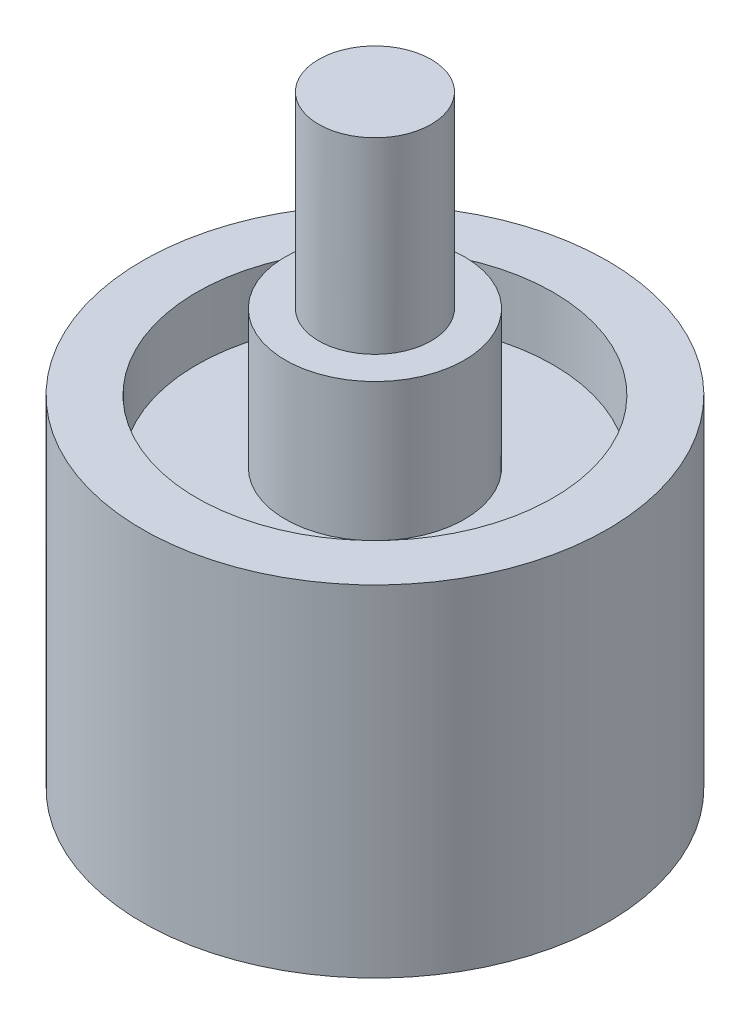
ISO-10303-21;
HEADER;
FILE_DESCRIPTION(('STEP AP214'),'2;1');
FILE_NAME('part.step','',(''),(''),'','','');
FILE_SCHEMA(('AUTOMOTIVE_DESIGN { 1 0 10303 214 1 1 1 1 }'));
ENDSEC;
DATA;
#1=APPLICATION_CONTEXT('core data for automotive mechanical design processes');
#2=APPLICATION_PROTOCOL_DEFINITION('international standard','automotive_design',2000,#1);
#3=PRODUCT_CONTEXT('',#1,'mechanical');
#4=PRODUCT('Part','Part','',(#3));
#5=PRODUCT_RELATED_PRODUCT_CATEGORY('part','',(#4));
#6=PRODUCT_DEFINITION_FORMATION('','',#4);
#7=PRODUCT_DEFINITION_CONTEXT('part definition',#1,'design');
#8=PRODUCT_DEFINITION('design','',#6,#7);
#9=PRODUCT_DEFINITION_SHAPE('','',#8);
#10=(LENGTH_UNIT() NAMED_UNIT(*) SI_UNIT(.MILLI.,.METRE.));
#11=(NAMED_UNIT(*) PLANE_ANGLE_UNIT() SI_UNIT($,.RADIAN.));
#12=(NAMED_UNIT(*) SI_UNIT($,.STERADIAN.) SOLID_ANGLE_UNIT());
#13=UNCERTAINTY_MEASURE_WITH_UNIT(LENGTH_MEASURE(1.E-05),#10,'distance_accuracy_value','');
#14=(GEOMETRIC_REPRESENTATION_CONTEXT(3) GLOBAL_UNCERTAINTY_ASSIGNED_CONTEXT((#13)) GLOBAL_UNIT_ASSIGNED_CONTEXT((#10,
#11,#12)) REPRESENTATION_CONTEXT('',''));
#15=CARTESIAN_POINT('',(0.,0.,0.));
#16=DIRECTION('',(0.,0.,1.));
#17=DIRECTION('',(1.,0.,0.));
#18=AXIS2_PLACEMENT_3D('',#15,#16,#17);
#19=CARTESIAN_POINT('',(0.,-10.35,0.));
#20=DIRECTION('',(0.,1.,0.));
#21=DIRECTION('',(0.,0.,1.));
#22=AXIS2_PLACEMENT_3D('',#19,#20,#21);
#23=CYLINDRICAL_SURFACE('',#22,4.775);
#24=CARTESIAN_POINT('',(0.,0.,0.));
#25=DIRECTION('',(0.,-1.,0.));
#26=DIRECTION('',(0.,0.,-1.));
#27=AXIS2_PLACEMENT_3D('',#24,#25,#26);
#28=CIRCLE('',#27,4.775);
#29=CARTESIAN_POINT('',(0.,0.,-4.775));
#30=VERTEX_POINT('',#29);
#31=EDGE_CURVE('E52',#30,#30,#28,.T.);
#32=ORIENTED_EDGE('',*,*,#31,.T.);
#33=EDGE_LOOP('',(#32));
#34=FACE_BOUND('',#33,.T.);
#35=CARTESIAN_POINT('',(0.,-7.35,0.));
#36=DIRECTION('',(0.,-1.,0.));
#37=DIRECTION('',(0.,0.,-1.));
#38=AXIS2_PLACEMENT_3D('',#35,#36,#37);
#39=CIRCLE('',#38,4.775);
#40=CARTESIAN_POINT('',(0.,-7.35,-4.775));
#41=VERTEX_POINT('',#40);
#42=EDGE_CURVE('E39',#41,#41,#39,.T.);
#43=ORIENTED_EDGE('',*,*,#42,.F.);
#44=EDGE_LOOP('',(#43));
#45=FACE_BOUND('',#44,.T.);
#46=ADVANCED_FACE('F32',(#34,#45),#23,.T.);
#47=CARTESIAN_POINT('',(0.,10.,0.));
#48=DIRECTION('',(0.,-1.,0.));
#49=DIRECTION('',(0.,0.,-1.));
#50=AXIS2_PLACEMENT_3D('',#47,#48,#49);
#51=CYLINDRICAL_SURFACE('',#50,3.);
#52=CARTESIAN_POINT('',(0.,10.,0.));
#53=DIRECTION('',(0.,1.,0.));
#54=DIRECTION('',(0.,0.,1.));
#55=AXIS2_PLACEMENT_3D('',#52,#53,#54);
#56=CIRCLE('',#55,3.);
#57=CARTESIAN_POINT('',(0.,10.,3.));
#58=VERTEX_POINT('',#57);
#59=EDGE_CURVE('E43',#58,#58,#56,.T.);
#60=ORIENTED_EDGE('',*,*,#59,.F.);
#61=EDGE_LOOP('',(#60));
#62=FACE_BOUND('',#61,.T.);
#63=CARTESIAN_POINT('',(0.,0.,0.));
#64=DIRECTION('',(0.,-1.,0.));
#65=DIRECTION('',(0.,0.,-1.));
#66=AXIS2_PLACEMENT_3D('',#63,#64,#65);
#67=CIRCLE('',#66,3.);
#68=CARTESIAN_POINT('',(0.,0.,-3.));
#69=VERTEX_POINT('',#68);
#70=EDGE_CURVE('E47',#69,#69,#67,.T.);
#71=ORIENTED_EDGE('',*,*,#70,.F.);
#72=EDGE_LOOP('',(#71));
#73=FACE_BOUND('',#72,.T.);
#74=ADVANCED_FACE('F34',(#62,#73),#51,.T.);
#75=CARTESIAN_POINT('',(0.,10.,0.));
#76=DIRECTION('',(0.,1.,0.));
#77=DIRECTION('',(0.,0.,1.));
#78=AXIS2_PLACEMENT_3D('',#75,#76,#77);
#79=PLANE('',#78);
#80=ORIENTED_EDGE('',*,*,#59,.T.);
#81=EDGE_LOOP('',(#80));
#82=FACE_BOUND('',#81,.T.);
#83=ADVANCED_FACE('F93',(#82),#79,.T.);
#84=CARTESIAN_POINT('',(0.,0.,0.));
#85=DIRECTION('',(0.,-1.,0.));
#86=DIRECTION('',(0.,0.,-1.));
#87=AXIS2_PLACEMENT_3D('',#84,#85,#86);
#88=PLANE('',#87);
#89=ORIENTED_EDGE('',*,*,#70,.T.);
#90=EDGE_LOOP('',(#89));
#91=FACE_BOUND('',#90,.T.);
#92=ORIENTED_EDGE('',*,*,#31,.F.);
#93=EDGE_LOOP('',(#92));
#94=FACE_BOUND('',#93,.T.);
#95=ADVANCED_FACE('F97',(#91,#94),#88,.F.);
#96=CARTESIAN_POINT('',(0.,-7.35,0.));
#97=DIRECTION('',(0.,-1.,0.));
#98=DIRECTION('',(0.,0.,-1.));
#99=AXIS2_PLACEMENT_3D('',#96,#97,#98);
#100=PLANE('',#99);
#101=ORIENTED_EDGE('',*,*,#42,.T.);
#102=EDGE_LOOP('',(#101));
#103=FACE_BOUND('',#102,.T.);
#104=CARTESIAN_POINT('',(0.,-7.35,0.));
#105=DIRECTION('',(0.,-1.,0.));
#106=DIRECTION('',(0.,0.,-1.));
#107=AXIS2_PLACEMENT_3D('',#104,#105,#106);
#108=CIRCLE('',#107,9.5);
#109=CARTESIAN_POINT('',(0.,-7.35,-9.5));
#110=VERTEX_POINT('',#109);
#111=EDGE_CURVE('E55',#110,#110,#108,.T.);
#112=ORIENTED_EDGE('',*,*,#111,.F.);
#113=EDGE_LOOP('',(#112));
#114=FACE_BOUND('',#113,.T.);
#115=ADVANCED_FACE('F104',(#103,#114),#100,.F.);
#116=CARTESIAN_POINT('',(0.,35.0724963468528,0.));
#117=DIRECTION('',(0.,-1.,0.));
#118=DIRECTION('',(0.,0.,-1.));
#119=AXIS2_PLACEMENT_3D('',#116,#117,#118);
#120=CYLINDRICAL_SURFACE('',#119,9.5);
#121=CARTESIAN_POINT('',(0.,-4.,0.));
#122=DIRECTION('',(0.,-1.,0.));
#123=DIRECTION('',(0.,0.,-1.));
#124=AXIS2_PLACEMENT_3D('',#121,#122,#123);
#125=CIRCLE('',#124,9.5);
#126=CARTESIAN_POINT('',(0.,-4.,-9.5));
#127=VERTEX_POINT('',#126);
#128=EDGE_CURVE('E58',#127,#127,#125,.F.);
#129=ORIENTED_EDGE('',*,*,#128,.T.);
#130=EDGE_LOOP('',(#129));
#131=FACE_BOUND('',#130,.T.);
#132=ORIENTED_EDGE('',*,*,#111,.T.);
#133=EDGE_LOOP('',(#132));
#134=FACE_BOUND('',#133,.T.);
#135=ADVANCED_FACE('F114',(#131,#134),#120,.F.);
#136=CARTESIAN_POINT('',(0.,35.0724963468528,0.));
#137=DIRECTION('',(0.,-1.,0.));
#138=DIRECTION('',(0.,0.,-1.));
#139=AXIS2_PLACEMENT_3D('',#136,#137,#138);
#140=CYLINDRICAL_SURFACE('',#139,12.4);
#141=CARTESIAN_POINT('',(0.,-4.,0.));
#142=DIRECTION('',(0.,-1.,0.));
#143=DIRECTION('',(0.,0.,-1.));
#144=AXIS2_PLACEMENT_3D('',#141,#142,#143);
#145=CIRCLE('',#144,12.4);
#146=CARTESIAN_POINT('',(0.,-4.,-12.4));
#147=VERTEX_POINT('',#146);
#148=EDGE_CURVE('E61',#147,#147,#145,.F.);
#149=ORIENTED_EDGE('',*,*,#148,.F.);
#150=EDGE_LOOP('',(#149));
#151=FACE_BOUND('',#150,.T.);
#152=CARTESIAN_POINT('',(0.,-22.15,0.));
#153=DIRECTION('',(0.,-1.,0.));
#154=DIRECTION('',(0.,0.,-1.));
#155=AXIS2_PLACEMENT_3D('',#152,#153,#154);
#156=CIRCLE('',#155,12.4);
#157=CARTESIAN_POINT('',(0.,-22.15,-12.4));
#158=VERTEX_POINT('',#157);
#159=EDGE_CURVE('E64',#158,#158,#156,.T.);
#160=ORIENTED_EDGE('',*,*,#159,.F.);
#161=EDGE_LOOP('',(#160));
#162=FACE_BOUND('',#161,.T.);
#163=ADVANCED_FACE('F84',(#151,#162),#140,.T.);
#164=CARTESIAN_POINT('',(0.,-4.,0.));
#165=DIRECTION('',(0.,-1.,0.));
#166=DIRECTION('',(0.,0.,-1.));
#167=AXIS2_PLACEMENT_3D('',#164,#165,#166);
#168=PLANE('',#167);
#169=ORIENTED_EDGE('',*,*,#148,.T.);
#170=EDGE_LOOP('',(#169));
#171=FACE_BOUND('',#170,.T.);
#172=ORIENTED_EDGE('',*,*,#128,.F.);
#173=EDGE_LOOP('',(#172));
#174=FACE_BOUND('',#173,.T.);
#175=ADVANCED_FACE('F75',(#171,#174),#168,.F.);
#176=CARTESIAN_POINT('',(0.,-22.15,0.));
#177=DIRECTION('',(0.,-1.,0.));
#178=DIRECTION('',(0.,0.,-1.));
#179=AXIS2_PLACEMENT_3D('',#176,#177,#178);
#180=PLANE('',#179);
#181=ORIENTED_EDGE('',*,*,#159,.T.);
#182=EDGE_LOOP('',(#181));
#183=FACE_BOUND('',#182,.T.);
#184=CARTESIAN_POINT('',(0.,-22.15,0.));
#185=DIRECTION('',(0.,-1.,0.));
#186=DIRECTION('',(0.,0.,-1.));
#187=AXIS2_PLACEMENT_3D('',#184,#185,#186);
#188=CIRCLE('',#187,9.5);
#189=CARTESIAN_POINT('',(0.,-22.15,-9.5));
#190=VERTEX_POINT('',#189);
#191=EDGE_CURVE('E67',#190,#190,#188,.T.);
#192=ORIENTED_EDGE('',*,*,#191,.F.);
#193=EDGE_LOOP('',(#192));
#194=FACE_BOUND('',#193,.T.);
#195=ADVANCED_FACE('F73',(#183,#194),#180,.T.);
#196=CARTESIAN_POINT('',(0.,-22.15,0.));
#197=DIRECTION('',(0.,1.,0.));
#198=DIRECTION('',(0.,0.,1.));
#199=AXIS2_PLACEMENT_3D('',#196,#197,#198);
#200=CYLINDRICAL_SURFACE('',#199,9.5);
#201=ORIENTED_EDGE('',*,*,#191,.T.);
#202=EDGE_LOOP('',(#201));
#203=FACE_BOUND('',#202,.T.);
#204=CARTESIAN_POINT('',(0.,-13.35,0.));
#205=DIRECTION('',(0.,-1.,0.));
#206=DIRECTION('',(0.,0.,-1.));
#207=AXIS2_PLACEMENT_3D('',#204,#205,#206);
#208=CIRCLE('',#207,9.5);
#209=CARTESIAN_POINT('',(0.,-13.35,-9.5));
#210=VERTEX_POINT('',#209);
#211=EDGE_CURVE('E11',#210,#210,#208,.F.);
#212=ORIENTED_EDGE('',*,*,#211,.T.);
#213=EDGE_LOOP('',(#212));
#214=FACE_BOUND('',#213,.T.);
#215=ADVANCED_FACE('F71',(#203,#214),#200,.F.);
#216=CARTESIAN_POINT('',(0.,-13.35,0.));
#217=DIRECTION('',(0.,-1.,0.));
#218=DIRECTION('',(0.,0.,-1.));
#219=AXIS2_PLACEMENT_3D('',#216,#217,#218);
#220=PLANE('',#219);
#221=ORIENTED_EDGE('',*,*,#211,.F.);
#222=EDGE_LOOP('',(#221));
#223=FACE_BOUND('',#222,.T.);
#224=ADVANCED_FACE('F82',(#223),#220,.T.);
#225=CLOSED_SHELL('',(#46,#74,#83,#95,#115,#135,#163,#175,#195,#215,#224));
#226=MANIFOLD_SOLID_BREP('B2',#225);
#227=ADVANCED_BREP_SHAPE_REPRESENTATION('',(#18,#226),#14);
#228=SHAPE_DEFINITION_REPRESENTATION(#9,#227);
ENDSEC;
END-ISO-10303-21;
